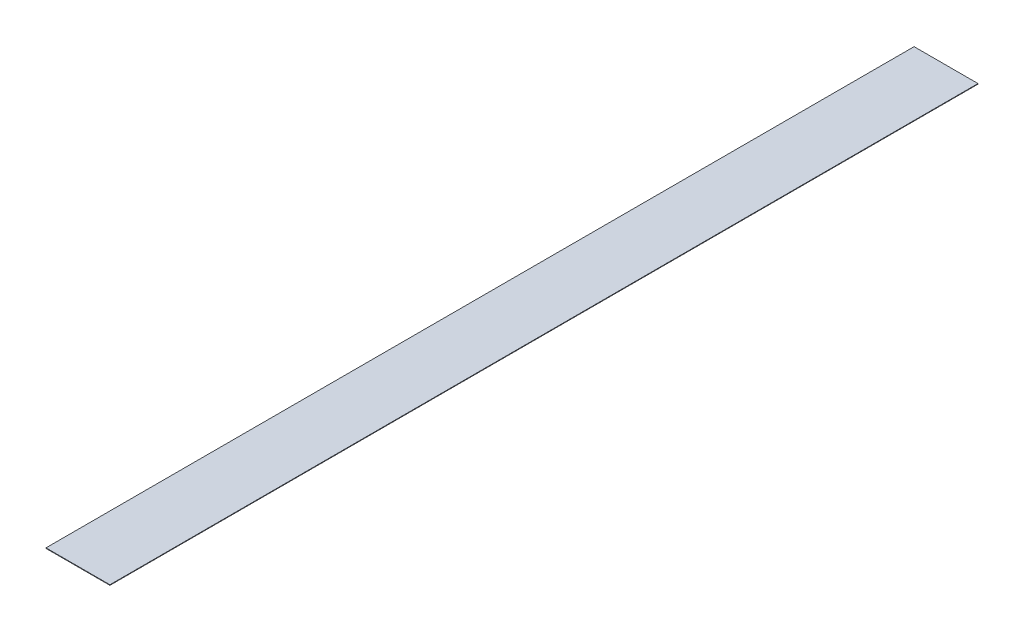
ISO-10303-21;
HEADER;
FILE_DESCRIPTION(('STEP AP214'),'2;1');
FILE_NAME('part.step','',(''),(''),'','','');
FILE_SCHEMA(('AUTOMOTIVE_DESIGN { 1 0 10303 214 1 1 1 1 }'));
ENDSEC;
DATA;
#1=APPLICATION_CONTEXT('core data for automotive mechanical design processes');
#2=APPLICATION_PROTOCOL_DEFINITION('international standard','automotive_design',2000,#1);
#3=PRODUCT_CONTEXT('',#1,'mechanical');
#4=PRODUCT('Part','Part','',(#3));
#5=PRODUCT_RELATED_PRODUCT_CATEGORY('part','',(#4));
#6=PRODUCT_DEFINITION_FORMATION('','',#4);
#7=PRODUCT_DEFINITION_CONTEXT('part definition',#1,'design');
#8=PRODUCT_DEFINITION('design','',#6,#7);
#9=PRODUCT_DEFINITION_SHAPE('','',#8);
#10=(LENGTH_UNIT() NAMED_UNIT(*) SI_UNIT(.MILLI.,.METRE.));
#11=(NAMED_UNIT(*) PLANE_ANGLE_UNIT() SI_UNIT($,.RADIAN.));
#12=(NAMED_UNIT(*) SI_UNIT($,.STERADIAN.) SOLID_ANGLE_UNIT());
#13=UNCERTAINTY_MEASURE_WITH_UNIT(LENGTH_MEASURE(1.E-05),#10,'distance_accuracy_value','');
#14=(GEOMETRIC_REPRESENTATION_CONTEXT(3) GLOBAL_UNCERTAINTY_ASSIGNED_CONTEXT((#13)) GLOBAL_UNIT_ASSIGNED_CONTEXT((#10,
#11,#12)) REPRESENTATION_CONTEXT('',''));
#15=CARTESIAN_POINT('',(0.,0.,0.));
#16=DIRECTION('',(0.,0.,1.));
#17=DIRECTION('',(1.,0.,0.));
#18=AXIS2_PLACEMENT_3D('',#15,#16,#17);
#19=CARTESIAN_POINT('',(599.999999999999,10.,-8150.));
#20=DIRECTION('',(-1.,0.,0.));
#21=DIRECTION('',(0.,0.,1.));
#22=AXIS2_PLACEMENT_3D('',#19,#20,#21);
#23=PLANE('',#22);
#24=DIRECTION('',(0.,0.,-1.));
#25=VECTOR('',#24,1.);
#26=CARTESIAN_POINT('',(599.999999999999,0.,-8150.));
#27=LINE('',#26,#25);
#28=CARTESIAN_POINT('',(600.000000000001,0.,8150.));
#29=VERTEX_POINT('',#28);
#30=CARTESIAN_POINT('',(599.999999999999,0.,-8150.));
#31=VERTEX_POINT('',#30);
#32=EDGE_CURVE('E95',#29,#31,#27,.T.);
#33=ORIENTED_EDGE('',*,*,#32,.T.);
#34=DIRECTION('',(0.,-1.,0.));
#35=VECTOR('',#34,1.);
#36=CARTESIAN_POINT('',(599.999999999999,10.,-8150.));
#37=LINE('',#36,#35);
#38=CARTESIAN_POINT('',(599.999999999999,10.,-8150.));
#39=VERTEX_POINT('',#38);
#40=EDGE_CURVE('E11',#39,#31,#37,.T.);
#41=ORIENTED_EDGE('',*,*,#40,.F.);
#42=DIRECTION('',(0.,0.,-1.));
#43=VECTOR('',#42,1.);
#44=CARTESIAN_POINT('',(599.999999999999,10.,-8150.));
#45=LINE('',#44,#43);
#46=CARTESIAN_POINT('',(600.000000000001,10.,8150.));
#47=VERTEX_POINT('',#46);
#48=EDGE_CURVE('E83',#47,#39,#45,.T.);
#49=ORIENTED_EDGE('',*,*,#48,.F.);
#50=DIRECTION('',(0.,-1.,0.));
#51=VECTOR('',#50,1.);
#52=CARTESIAN_POINT('',(600.000000000001,10.,8150.));
#53=LINE('',#52,#51);
#54=EDGE_CURVE('E91',#47,#29,#53,.T.);
#55=ORIENTED_EDGE('',*,*,#54,.T.);
#56=EDGE_LOOP('',(#33,#41,#49,#55));
#57=FACE_BOUND('',#56,.T.);
#58=ADVANCED_FACE('F32',(#57),#23,.F.);
#59=CARTESIAN_POINT('',(-600.000000000001,10.,-8150.));
#60=DIRECTION('',(0.,0.,1.));
#61=DIRECTION('',(1.,0.,0.));
#62=AXIS2_PLACEMENT_3D('',#59,#60,#61);
#63=PLANE('',#62);
#64=DIRECTION('',(-1.,0.,0.));
#65=VECTOR('',#64,1.);
#66=CARTESIAN_POINT('',(-600.000000000001,0.,-8150.));
#67=LINE('',#66,#65);
#68=CARTESIAN_POINT('',(-600.000000000001,0.,-8150.));
#69=VERTEX_POINT('',#68);
#70=EDGE_CURVE('E87',#31,#69,#67,.T.);
#71=ORIENTED_EDGE('',*,*,#70,.T.);
#72=DIRECTION('',(0.,-1.,0.));
#73=VECTOR('',#72,1.);
#74=CARTESIAN_POINT('',(-600.000000000001,10.,-8150.));
#75=LINE('',#74,#73);
#76=CARTESIAN_POINT('',(-600.000000000001,10.,-8150.));
#77=VERTEX_POINT('',#76);
#78=EDGE_CURVE('E40',#77,#69,#75,.T.);
#79=ORIENTED_EDGE('',*,*,#78,.F.);
#80=DIRECTION('',(-1.,0.,0.));
#81=VECTOR('',#80,1.);
#82=CARTESIAN_POINT('',(-600.000000000001,10.,-8150.));
#83=LINE('',#82,#81);
#84=EDGE_CURVE('E78',#39,#77,#83,.T.);
#85=ORIENTED_EDGE('',*,*,#84,.F.);
#86=ORIENTED_EDGE('',*,*,#40,.T.);
#87=EDGE_LOOP('',(#71,#79,#85,#86));
#88=FACE_BOUND('',#87,.T.);
#89=ADVANCED_FACE('F86',(#88),#63,.F.);
#90=CARTESIAN_POINT('',(-600.000000000001,10.,-8150.));
#91=DIRECTION('',(1.,0.,0.));
#92=DIRECTION('',(0.,0.,-1.));
#93=AXIS2_PLACEMENT_3D('',#90,#91,#92);
#94=PLANE('',#93);
#95=DIRECTION('',(0.,0.,1.));
#96=VECTOR('',#95,1.);
#97=CARTESIAN_POINT('',(-600.000000000001,0.,-8150.));
#98=LINE('',#97,#96);
#99=CARTESIAN_POINT('',(-599.999999999999,0.,8150.));
#100=VERTEX_POINT('',#99);
#101=EDGE_CURVE('E65',#69,#100,#98,.T.);
#102=ORIENTED_EDGE('',*,*,#101,.T.);
#103=DIRECTION('',(0.,-1.,0.));
#104=VECTOR('',#103,1.);
#105=CARTESIAN_POINT('',(-599.999999999999,10.,8150.));
#106=LINE('',#105,#104);
#107=CARTESIAN_POINT('',(-599.999999999999,10.,8150.));
#108=VERTEX_POINT('',#107);
#109=EDGE_CURVE('E88',#108,#100,#106,.T.);
#110=ORIENTED_EDGE('',*,*,#109,.F.);
#111=DIRECTION('',(0.,0.,1.));
#112=VECTOR('',#111,1.);
#113=CARTESIAN_POINT('',(-600.000000000001,10.,-8150.));
#114=LINE('',#113,#112);
#115=EDGE_CURVE('E81',#77,#108,#114,.T.);
#116=ORIENTED_EDGE('',*,*,#115,.F.);
#117=ORIENTED_EDGE('',*,*,#78,.T.);
#118=EDGE_LOOP('',(#102,#110,#116,#117));
#119=FACE_BOUND('',#118,.T.);
#120=ADVANCED_FACE('F89',(#119),#94,.F.);
#121=CARTESIAN_POINT('',(-599.999999999999,10.,8150.));
#122=DIRECTION('',(0.,0.,-1.));
#123=DIRECTION('',(-1.,0.,0.));
#124=AXIS2_PLACEMENT_3D('',#121,#122,#123);
#125=PLANE('',#124);
#126=DIRECTION('',(1.,0.,0.));
#127=VECTOR('',#126,1.);
#128=CARTESIAN_POINT('',(-599.999999999999,0.,8150.));
#129=LINE('',#128,#127);
#130=EDGE_CURVE('E71',#100,#29,#129,.T.);
#131=ORIENTED_EDGE('',*,*,#130,.T.);
#132=ORIENTED_EDGE('',*,*,#54,.F.);
#133=DIRECTION('',(1.,0.,0.));
#134=VECTOR('',#133,1.);
#135=CARTESIAN_POINT('',(-599.999999999999,10.,8150.));
#136=LINE('',#135,#134);
#137=EDGE_CURVE('E48',#108,#47,#136,.T.);
#138=ORIENTED_EDGE('',*,*,#137,.F.);
#139=ORIENTED_EDGE('',*,*,#109,.T.);
#140=EDGE_LOOP('',(#131,#132,#138,#139));
#141=FACE_BOUND('',#140,.T.);
#142=ADVANCED_FACE('F102',(#141),#125,.F.);
#143=CARTESIAN_POINT('',(0.,10.,0.));
#144=DIRECTION('',(0.,1.,0.));
#145=DIRECTION('',(0.,0.,1.));
#146=AXIS2_PLACEMENT_3D('',#143,#144,#145);
#147=PLANE('',#146);
#148=ORIENTED_EDGE('',*,*,#48,.T.);
#149=ORIENTED_EDGE('',*,*,#84,.T.);
#150=ORIENTED_EDGE('',*,*,#115,.T.);
#151=ORIENTED_EDGE('',*,*,#137,.T.);
#152=EDGE_LOOP('',(#148,#149,#150,#151));
#153=FACE_BOUND('',#152,.T.);
#154=ADVANCED_FACE('F79',(#153),#147,.T.);
#155=CARTESIAN_POINT('',(0.,0.,0.));
#156=DIRECTION('',(0.,1.,0.));
#157=DIRECTION('',(0.,0.,1.));
#158=AXIS2_PLACEMENT_3D('',#155,#156,#157);
#159=PLANE('',#158);
#160=ORIENTED_EDGE('',*,*,#32,.F.);
#161=ORIENTED_EDGE('',*,*,#130,.F.);
#162=ORIENTED_EDGE('',*,*,#101,.F.);
#163=ORIENTED_EDGE('',*,*,#70,.F.);
#164=EDGE_LOOP('',(#160,#161,#162,#163));
#165=FACE_BOUND('',#164,.T.);
#166=ADVANCED_FACE('F105',(#165),#159,.F.);
#167=CLOSED_SHELL('',(#58,#89,#120,#142,#154,#166));
#168=MANIFOLD_SOLID_BREP('B2',#167);
#169=ADVANCED_BREP_SHAPE_REPRESENTATION('',(#18,#168),#14);
#170=SHAPE_DEFINITION_REPRESENTATION(#9,#169);
ENDSEC;
END-ISO-10303-21;
